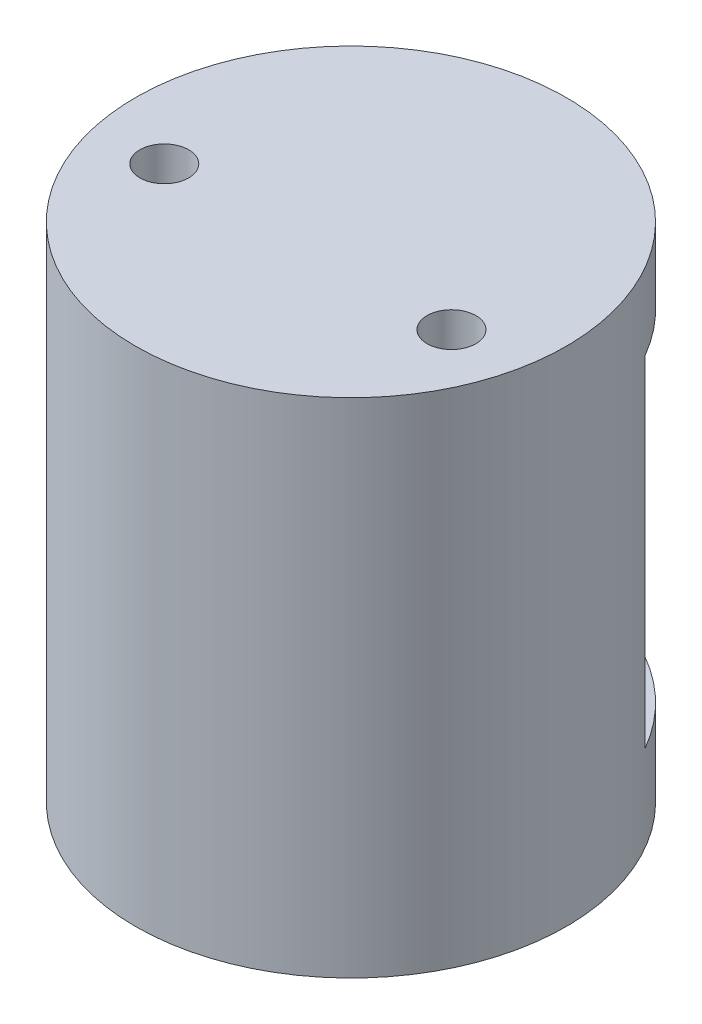
ISO-10303-21;
HEADER;
FILE_DESCRIPTION(('STEP AP214'),'2;1');
FILE_NAME('part.step','',(''),(''),'','','');
FILE_SCHEMA(('AUTOMOTIVE_DESIGN { 1 0 10303 214 1 1 1 1 }'));
ENDSEC;
DATA;
#1=APPLICATION_CONTEXT('core data for automotive mechanical design processes');
#2=APPLICATION_PROTOCOL_DEFINITION('international standard','automotive_design',2000,#1);
#3=PRODUCT_CONTEXT('',#1,'mechanical');
#4=PRODUCT('Part','Part','',(#3));
#5=PRODUCT_RELATED_PRODUCT_CATEGORY('part','',(#4));
#6=PRODUCT_DEFINITION_FORMATION('','',#4);
#7=PRODUCT_DEFINITION_CONTEXT('part definition',#1,'design');
#8=PRODUCT_DEFINITION('design','',#6,#7);
#9=PRODUCT_DEFINITION_SHAPE('','',#8);
#10=(LENGTH_UNIT() NAMED_UNIT(*) SI_UNIT(.MILLI.,.METRE.));
#11=(NAMED_UNIT(*) PLANE_ANGLE_UNIT() SI_UNIT($,.RADIAN.));
#12=(NAMED_UNIT(*) SI_UNIT($,.STERADIAN.) SOLID_ANGLE_UNIT());
#13=UNCERTAINTY_MEASURE_WITH_UNIT(LENGTH_MEASURE(1.E-05),#10,'distance_accuracy_value','');
#14=(GEOMETRIC_REPRESENTATION_CONTEXT(3) GLOBAL_UNCERTAINTY_ASSIGNED_CONTEXT((#13)) GLOBAL_UNIT_ASSIGNED_CONTEXT((#10,
#11,#12)) REPRESENTATION_CONTEXT('',''));
#15=CARTESIAN_POINT('',(0.,0.,0.));
#16=DIRECTION('',(0.,0.,1.));
#17=DIRECTION('',(1.,0.,0.));
#18=AXIS2_PLACEMENT_3D('',#15,#16,#17);
#19=CARTESIAN_POINT('',(0.,35.,0.));
#20=DIRECTION('',(0.,-1.,0.));
#21=DIRECTION('',(0.,0.,-1.));
#22=AXIS2_PLACEMENT_3D('',#19,#20,#21);
#23=CYLINDRICAL_SURFACE('',#22,15.);
#24=CARTESIAN_POINT('',(0.,0.,0.));
#25=DIRECTION('',(0.,1.,0.));
#26=DIRECTION('',(0.,0.,1.));
#27=AXIS2_PLACEMENT_3D('',#24,#25,#26);
#28=CIRCLE('',#27,15.);
#29=CARTESIAN_POINT('',(0.,0.,15.));
#30=VERTEX_POINT('',#29);
#31=EDGE_CURVE('E183',#30,#30,#28,.T.);
#32=ORIENTED_EDGE('',*,*,#31,.T.);
#33=EDGE_LOOP('',(#32));
#34=FACE_BOUND('',#33,.T.);
#35=CARTESIAN_POINT('',(0.,35.,0.));
#36=DIRECTION('',(0.,1.,0.));
#37=DIRECTION('',(0.,0.,1.));
#38=AXIS2_PLACEMENT_3D('',#35,#36,#37);
#39=CIRCLE('',#38,15.);
#40=CARTESIAN_POINT('',(0.,35.,15.));
#41=VERTEX_POINT('',#40);
#42=EDGE_CURVE('E184',#41,#41,#39,.T.);
#43=ORIENTED_EDGE('',*,*,#42,.F.);
#44=EDGE_LOOP('',(#43));
#45=FACE_BOUND('',#44,.T.);
#46=DIRECTION('',(0.,-1.,0.));
#47=VECTOR('',#46,1.);
#48=CARTESIAN_POINT('',(-14.9916643505649,35.,-0.499999999999999));
#49=LINE('',#48,#47);
#50=CARTESIAN_POINT('',(-14.9916643505649,30.7,-0.5));
#51=VERTEX_POINT('',#50);
#52=CARTESIAN_POINT('',(-14.9916643505649,29.7,-0.5));
#53=VERTEX_POINT('',#52);
#54=EDGE_CURVE('E11',#51,#53,#49,.T.);
#55=ORIENTED_EDGE('',*,*,#54,.F.);
#56=CARTESIAN_POINT('',(0.,30.7,0.));
#57=DIRECTION('',(0.,-1.,0.));
#58=DIRECTION('',(0.,0.,-1.));
#59=AXIS2_PLACEMENT_3D('',#56,#57,#58);
#60=CIRCLE('',#59,15.);
#61=CARTESIAN_POINT('',(-13.7477270848675,30.7,6.));
#62=VERTEX_POINT('',#61);
#63=EDGE_CURVE('E47',#62,#51,#60,.T.);
#64=ORIENTED_EDGE('',*,*,#63,.F.);
#65=DIRECTION('',(0.,-1.,0.));
#66=VECTOR('',#65,1.);
#67=CARTESIAN_POINT('',(-13.7477270848675,35.,6.));
#68=LINE('',#67,#66);
#69=CARTESIAN_POINT('',(-13.7477270848675,5.,5.99999999999999));
#70=VERTEX_POINT('',#69);
#71=EDGE_CURVE('E206',#70,#62,#68,.F.);
#72=ORIENTED_EDGE('',*,*,#71,.F.);
#73=CARTESIAN_POINT('',(0.,5.,0.));
#74=DIRECTION('',(0.,1.,0.));
#75=DIRECTION('',(0.,0.,1.));
#76=AXIS2_PLACEMENT_3D('',#73,#74,#75);
#77=CIRCLE('',#76,15.);
#78=CARTESIAN_POINT('',(-14.9916643505649,5.,-0.500000000000003));
#79=VERTEX_POINT('',#78);
#80=EDGE_CURVE('E203',#79,#70,#77,.T.);
#81=ORIENTED_EDGE('',*,*,#80,.F.);
#82=DIRECTION('',(0.,-1.,0.));
#83=VECTOR('',#82,1.);
#84=CARTESIAN_POINT('',(-14.9916643505649,35.,-0.499999999999986));
#85=LINE('',#84,#83);
#86=CARTESIAN_POINT('',(-14.9916643505649,6.,-0.500000000000002));
#87=VERTEX_POINT('',#86);
#88=EDGE_CURVE('E200',#87,#79,#85,.T.);
#89=ORIENTED_EDGE('',*,*,#88,.F.);
#90=CARTESIAN_POINT('',(0.,6.,0.));
#91=DIRECTION('',(0.,1.,0.));
#92=DIRECTION('',(0.,0.,1.));
#93=AXIS2_PLACEMENT_3D('',#90,#91,#92);
#94=CIRCLE('',#93,15.);
#95=CARTESIAN_POINT('',(13.,6.,-7.48331477354788));
#96=VERTEX_POINT('',#95);
#97=EDGE_CURVE('E197',#96,#87,#94,.T.);
#98=ORIENTED_EDGE('',*,*,#97,.F.);
#99=DIRECTION('',(0.,-1.,0.));
#100=VECTOR('',#99,1.);
#101=CARTESIAN_POINT('',(13.,35.,-7.48331477354788));
#102=LINE('',#101,#100);
#103=CARTESIAN_POINT('',(13.,29.7,-7.48331477354788));
#104=VERTEX_POINT('',#103);
#105=EDGE_CURVE('E188',#104,#96,#102,.T.);
#106=ORIENTED_EDGE('',*,*,#105,.F.);
#107=CARTESIAN_POINT('',(0.,29.7,0.));
#108=DIRECTION('',(0.,-1.,0.));
#109=DIRECTION('',(0.,0.,-1.));
#110=AXIS2_PLACEMENT_3D('',#107,#108,#109);
#111=CIRCLE('',#110,15.);
#112=EDGE_CURVE('E194',#53,#104,#111,.T.);
#113=ORIENTED_EDGE('',*,*,#112,.F.);
#114=EDGE_LOOP('',(#55,#64,#72,#81,#89,#98,#106,#113));
#115=FACE_BOUND('',#114,.T.);
#116=ADVANCED_FACE('F39',(#34,#45,#115),#23,.T.);
#117=CARTESIAN_POINT('',(0.,35.,0.));
#118=DIRECTION('',(0.,1.,0.));
#119=DIRECTION('',(0.,0.,1.));
#120=AXIS2_PLACEMENT_3D('',#117,#118,#119);
#121=PLANE('',#120);
#122=CARTESIAN_POINT('',(-10.,35.,3.));
#123=DIRECTION('',(0.,1.,0.));
#124=DIRECTION('',(0.,0.,1.));
#125=AXIS2_PLACEMENT_3D('',#122,#123,#124);
#126=CIRCLE('',#125,1.7);
#127=CARTESIAN_POINT('',(-10.,35.,4.7));
#128=VERTEX_POINT('',#127);
#129=EDGE_CURVE('E403',#128,#128,#126,.T.);
#130=ORIENTED_EDGE('',*,*,#129,.F.);
#131=EDGE_LOOP('',(#130));
#132=FACE_BOUND('',#131,.T.);
#133=CARTESIAN_POINT('',(10.,35.,3.));
#134=DIRECTION('',(0.,1.,0.));
#135=DIRECTION('',(0.,0.,1.));
#136=AXIS2_PLACEMENT_3D('',#133,#134,#135);
#137=CIRCLE('',#136,1.7);
#138=CARTESIAN_POINT('',(10.,35.,4.7));
#139=VERTEX_POINT('',#138);
#140=EDGE_CURVE('E410',#139,#139,#137,.T.);
#141=ORIENTED_EDGE('',*,*,#140,.F.);
#142=EDGE_LOOP('',(#141));
#143=FACE_BOUND('',#142,.T.);
#144=ORIENTED_EDGE('',*,*,#42,.T.);
#145=EDGE_LOOP('',(#144));
#146=FACE_BOUND('',#145,.T.);
#147=ADVANCED_FACE('F252',(#132,#143,#146),#121,.T.);
#148=CARTESIAN_POINT('',(0.,0.,0.));
#149=DIRECTION('',(0.,1.,0.));
#150=DIRECTION('',(0.,0.,1.));
#151=AXIS2_PLACEMENT_3D('',#148,#149,#150);
#152=PLANE('',#151);
#153=DIRECTION('',(-1.,0.,0.));
#154=VECTOR('',#153,1.);
#155=CARTESIAN_POINT('',(-9.69793792514677,0.,8.2));
#156=LINE('',#155,#154);
#157=CARTESIAN_POINT('',(9.69793792514677,0.,8.2));
#158=VERTEX_POINT('',#157);
#159=CARTESIAN_POINT('',(-9.69793792514677,0.,8.2));
#160=VERTEX_POINT('',#159);
#161=EDGE_CURVE('E123',#158,#160,#156,.T.);
#162=ORIENTED_EDGE('',*,*,#161,.F.);
#163=CARTESIAN_POINT('',(0.,0.,0.));
#164=DIRECTION('',(0.,-1.,0.));
#165=DIRECTION('',(0.,0.,-1.));
#166=AXIS2_PLACEMENT_3D('',#163,#164,#165);
#167=CIRCLE('',#166,12.7);
#168=EDGE_CURVE('E54',#160,#158,#167,.T.);
#169=ORIENTED_EDGE('',*,*,#168,.F.);
#170=EDGE_LOOP('',(#162,#169));
#171=FACE_BOUND('',#170,.T.);
#172=ORIENTED_EDGE('',*,*,#31,.F.);
#173=EDGE_LOOP('',(#172));
#174=FACE_BOUND('',#173,.T.);
#175=ADVANCED_FACE('F257',(#171,#174),#152,.F.);
#176=CARTESIAN_POINT('',(13.,30.7,6.));
#177=DIRECTION('',(0.,-1.,0.));
#178=DIRECTION('',(0.,0.,-1.));
#179=AXIS2_PLACEMENT_3D('',#176,#177,#178);
#180=PLANE('',#179);
#181=CARTESIAN_POINT('',(-10.,30.7,3.));
#182=DIRECTION('',(0.,-1.,0.));
#183=DIRECTION('',(0.,0.,-1.));
#184=AXIS2_PLACEMENT_3D('',#181,#182,#183);
#185=CIRCLE('',#184,1.7);
#186=CARTESIAN_POINT('',(-10.,30.7,1.3));
#187=VERTEX_POINT('',#186);
#188=EDGE_CURVE('E400',#187,#187,#185,.F.);
#189=ORIENTED_EDGE('',*,*,#188,.T.);
#190=EDGE_LOOP('',(#189));
#191=FACE_BOUND('',#190,.T.);
#192=CARTESIAN_POINT('',(10.,30.7,3.));
#193=DIRECTION('',(0.,-1.,0.));
#194=DIRECTION('',(0.,0.,-1.));
#195=AXIS2_PLACEMENT_3D('',#192,#193,#194);
#196=CIRCLE('',#195,1.7);
#197=CARTESIAN_POINT('',(10.,30.7,1.3));
#198=VERTEX_POINT('',#197);
#199=EDGE_CURVE('E413',#198,#198,#196,.F.);
#200=ORIENTED_EDGE('',*,*,#199,.T.);
#201=EDGE_LOOP('',(#200));
#202=FACE_BOUND('',#201,.T.);
#203=ORIENTED_EDGE('',*,*,#63,.T.);
#204=DIRECTION('',(-1.,0.,0.));
#205=VECTOR('',#204,1.);
#206=CARTESIAN_POINT('',(13.,30.7,-0.5));
#207=LINE('',#206,#205);
#208=CARTESIAN_POINT('',(13.,30.7,-0.5));
#209=VERTEX_POINT('',#208);
#210=EDGE_CURVE('E159',#209,#51,#207,.T.);
#211=ORIENTED_EDGE('',*,*,#210,.F.);
#212=DIRECTION('',(0.,0.,1.));
#213=VECTOR('',#212,1.);
#214=CARTESIAN_POINT('',(13.,30.7,6.));
#215=LINE('',#214,#213);
#216=CARTESIAN_POINT('',(13.,30.7,6.));
#217=VERTEX_POINT('',#216);
#218=EDGE_CURVE('E136',#209,#217,#215,.T.);
#219=ORIENTED_EDGE('',*,*,#218,.T.);
#220=DIRECTION('',(-1.,0.,0.));
#221=VECTOR('',#220,1.);
#222=CARTESIAN_POINT('',(13.,30.7,6.));
#223=LINE('',#222,#221);
#224=EDGE_CURVE('E179',#217,#62,#223,.T.);
#225=ORIENTED_EDGE('',*,*,#224,.T.);
#226=EDGE_LOOP('',(#203,#211,#219,#225));
#227=FACE_BOUND('',#226,.T.);
#228=ADVANCED_FACE('F212',(#191,#202,#227),#180,.T.);
#229=CARTESIAN_POINT('',(13.,30.7,6.));
#230=DIRECTION('',(0.,0.,-1.));
#231=DIRECTION('',(0.,1.,0.));
#232=AXIS2_PLACEMENT_3D('',#229,#230,#231);
#233=PLANE('',#232);
#234=ORIENTED_EDGE('',*,*,#71,.T.);
#235=ORIENTED_EDGE('',*,*,#224,.F.);
#236=DIRECTION('',(0.,-1.,0.));
#237=VECTOR('',#236,1.);
#238=CARTESIAN_POINT('',(13.,30.7,6.));
#239=LINE('',#238,#237);
#240=CARTESIAN_POINT('',(13.,5.,6.));
#241=VERTEX_POINT('',#240);
#242=EDGE_CURVE('E141',#217,#241,#239,.T.);
#243=ORIENTED_EDGE('',*,*,#242,.T.);
#244=DIRECTION('',(-1.,0.,0.));
#245=VECTOR('',#244,1.);
#246=CARTESIAN_POINT('',(13.,5.,6.));
#247=LINE('',#246,#245);
#248=EDGE_CURVE('E175',#241,#70,#247,.T.);
#249=ORIENTED_EDGE('',*,*,#248,.T.);
#250=EDGE_LOOP('',(#234,#235,#243,#249));
#251=FACE_BOUND('',#250,.T.);
#252=ADVANCED_FACE('F229',(#251),#233,.T.);
#253=CARTESIAN_POINT('',(13.,5.,-0.500000000000003));
#254=DIRECTION('',(0.,1.,0.));
#255=DIRECTION('',(0.,0.,1.));
#256=AXIS2_PLACEMENT_3D('',#253,#254,#255);
#257=PLANE('',#256);
#258=ORIENTED_EDGE('',*,*,#80,.T.);
#259=ORIENTED_EDGE('',*,*,#248,.F.);
#260=DIRECTION('',(0.,0.,-1.));
#261=VECTOR('',#260,1.);
#262=CARTESIAN_POINT('',(13.,5.,-0.500000000000003));
#263=LINE('',#262,#261);
#264=CARTESIAN_POINT('',(13.,5.,-0.500000000000003));
#265=VERTEX_POINT('',#264);
#266=EDGE_CURVE('E144',#241,#265,#263,.T.);
#267=ORIENTED_EDGE('',*,*,#266,.T.);
#268=DIRECTION('',(-1.,0.,0.));
#269=VECTOR('',#268,1.);
#270=CARTESIAN_POINT('',(13.,5.,-0.500000000000003));
#271=LINE('',#270,#269);
#272=EDGE_CURVE('E171',#265,#79,#271,.T.);
#273=ORIENTED_EDGE('',*,*,#272,.T.);
#274=EDGE_LOOP('',(#258,#259,#267,#273));
#275=FACE_BOUND('',#274,.T.);
#276=ADVANCED_FACE('F234',(#275),#257,.T.);
#277=CARTESIAN_POINT('',(13.,6.,-0.500000000000002));
#278=DIRECTION('',(0.,0.,1.));
#279=DIRECTION('',(0.,-1.,0.));
#280=AXIS2_PLACEMENT_3D('',#277,#278,#279);
#281=PLANE('',#280);
#282=ORIENTED_EDGE('',*,*,#88,.T.);
#283=ORIENTED_EDGE('',*,*,#272,.F.);
#284=DIRECTION('',(0.,1.,0.));
#285=VECTOR('',#284,1.);
#286=CARTESIAN_POINT('',(13.,6.,-0.500000000000002));
#287=LINE('',#286,#285);
#288=CARTESIAN_POINT('',(13.,6.,-0.500000000000002));
#289=VERTEX_POINT('',#288);
#290=EDGE_CURVE('E147',#265,#289,#287,.T.);
#291=ORIENTED_EDGE('',*,*,#290,.T.);
#292=DIRECTION('',(-1.,0.,0.));
#293=VECTOR('',#292,1.);
#294=CARTESIAN_POINT('',(13.,6.,-0.500000000000002));
#295=LINE('',#294,#293);
#296=EDGE_CURVE('E167',#289,#87,#295,.T.);
#297=ORIENTED_EDGE('',*,*,#296,.T.);
#298=EDGE_LOOP('',(#282,#283,#291,#297));
#299=FACE_BOUND('',#298,.T.);
#300=ADVANCED_FACE('F238',(#299),#281,.T.);
#301=CARTESIAN_POINT('',(13.,6.,-16.));
#302=DIRECTION('',(0.,1.,0.));
#303=DIRECTION('',(0.,0.,1.));
#304=AXIS2_PLACEMENT_3D('',#301,#302,#303);
#305=PLANE('',#304);
#306=ORIENTED_EDGE('',*,*,#97,.T.);
#307=ORIENTED_EDGE('',*,*,#296,.F.);
#308=DIRECTION('',(0.,0.,-1.));
#309=VECTOR('',#308,1.);
#310=CARTESIAN_POINT('',(13.,6.,-16.));
#311=LINE('',#310,#309);
#312=EDGE_CURVE('E150',#289,#96,#311,.T.);
#313=ORIENTED_EDGE('',*,*,#312,.T.);
#314=EDGE_LOOP('',(#306,#307,#313));
#315=FACE_BOUND('',#314,.T.);
#316=ADVANCED_FACE('F242',(#315),#305,.T.);
#317=CARTESIAN_POINT('',(13.,29.7,-0.5));
#318=DIRECTION('',(0.,-1.,0.));
#319=DIRECTION('',(0.,0.,-1.));
#320=AXIS2_PLACEMENT_3D('',#317,#318,#319);
#321=PLANE('',#320);
#322=ORIENTED_EDGE('',*,*,#112,.T.);
#323=DIRECTION('',(0.,0.,1.));
#324=VECTOR('',#323,1.);
#325=CARTESIAN_POINT('',(13.,29.7,-0.5));
#326=LINE('',#325,#324);
#327=CARTESIAN_POINT('',(13.,29.7,-0.5));
#328=VERTEX_POINT('',#327);
#329=EDGE_CURVE('E62',#104,#328,#326,.T.);
#330=ORIENTED_EDGE('',*,*,#329,.T.);
#331=DIRECTION('',(-1.,0.,0.));
#332=VECTOR('',#331,1.);
#333=CARTESIAN_POINT('',(13.,29.7,-0.5));
#334=LINE('',#333,#332);
#335=EDGE_CURVE('E163',#328,#53,#334,.T.);
#336=ORIENTED_EDGE('',*,*,#335,.T.);
#337=EDGE_LOOP('',(#322,#330,#336));
#338=FACE_BOUND('',#337,.T.);
#339=ADVANCED_FACE('F225',(#338),#321,.T.);
#340=CARTESIAN_POINT('',(13.,30.7,-0.5));
#341=DIRECTION('',(0.,0.,1.));
#342=DIRECTION('',(0.,-1.,0.));
#343=AXIS2_PLACEMENT_3D('',#340,#341,#342);
#344=PLANE('',#343);
#345=ORIENTED_EDGE('',*,*,#54,.T.);
#346=ORIENTED_EDGE('',*,*,#335,.F.);
#347=DIRECTION('',(0.,1.,0.));
#348=VECTOR('',#347,1.);
#349=CARTESIAN_POINT('',(13.,30.7,-0.5));
#350=LINE('',#349,#348);
#351=EDGE_CURVE('E156',#328,#209,#350,.T.);
#352=ORIENTED_EDGE('',*,*,#351,.T.);
#353=ORIENTED_EDGE('',*,*,#210,.T.);
#354=EDGE_LOOP('',(#345,#346,#352,#353));
#355=FACE_BOUND('',#354,.T.);
#356=ADVANCED_FACE('F219',(#355),#344,.T.);
#357=CARTESIAN_POINT('',(13.,0.,0.));
#358=DIRECTION('',(-1.,0.,0.));
#359=DIRECTION('',(0.,0.,1.));
#360=AXIS2_PLACEMENT_3D('',#357,#358,#359);
#361=PLANE('',#360);
#362=ORIENTED_EDGE('',*,*,#105,.T.);
#363=ORIENTED_EDGE('',*,*,#312,.F.);
#364=ORIENTED_EDGE('',*,*,#290,.F.);
#365=ORIENTED_EDGE('',*,*,#266,.F.);
#366=ORIENTED_EDGE('',*,*,#242,.F.);
#367=ORIENTED_EDGE('',*,*,#218,.F.);
#368=ORIENTED_EDGE('',*,*,#351,.F.);
#369=ORIENTED_EDGE('',*,*,#329,.F.);
#370=EDGE_LOOP('',(#362,#363,#364,#365,#366,#367,#368,#369));
#371=FACE_BOUND('',#370,.T.);
#372=ADVANCED_FACE('F226',(#371),#361,.T.);
#373=CARTESIAN_POINT('',(0.,1.5,0.));
#374=DIRECTION('',(0.,-1.,0.));
#375=DIRECTION('',(0.,0.,-1.));
#376=AXIS2_PLACEMENT_3D('',#373,#374,#375);
#377=CYLINDRICAL_SURFACE('',#376,12.7);
#378=ORIENTED_EDGE('',*,*,#168,.T.);
#379=DIRECTION('',(0.,-1.,0.));
#380=VECTOR('',#379,1.);
#381=CARTESIAN_POINT('',(9.69793792514677,1.5,8.2));
#382=LINE('',#381,#380);
#383=CARTESIAN_POINT('',(9.69793792514677,1.5,8.2));
#384=VERTEX_POINT('',#383);
#385=EDGE_CURVE('E107',#384,#158,#382,.T.);
#386=ORIENTED_EDGE('',*,*,#385,.F.);
#387=CARTESIAN_POINT('',(0.,1.5,0.));
#388=DIRECTION('',(0.,-1.,0.));
#389=DIRECTION('',(0.,0.,-1.));
#390=AXIS2_PLACEMENT_3D('',#387,#388,#389);
#391=CIRCLE('',#390,12.7);
#392=CARTESIAN_POINT('',(-9.69793792514677,1.5,8.2));
#393=VERTEX_POINT('',#392);
#394=EDGE_CURVE('E110',#393,#384,#391,.T.);
#395=ORIENTED_EDGE('',*,*,#394,.F.);
#396=DIRECTION('',(0.,-1.,0.));
#397=VECTOR('',#396,1.);
#398=CARTESIAN_POINT('',(-9.69793792514677,1.5,8.2));
#399=LINE('',#398,#397);
#400=EDGE_CURVE('E117',#393,#160,#399,.T.);
#401=ORIENTED_EDGE('',*,*,#400,.T.);
#402=EDGE_LOOP('',(#378,#386,#395,#401));
#403=FACE_BOUND('',#402,.T.);
#404=ADVANCED_FACE('F109',(#403),#377,.F.);
#405=CARTESIAN_POINT('',(-9.69793792514677,1.5,8.2));
#406=DIRECTION('',(0.,0.,1.));
#407=DIRECTION('',(1.,0.,0.));
#408=AXIS2_PLACEMENT_3D('',#405,#406,#407);
#409=PLANE('',#408);
#410=ORIENTED_EDGE('',*,*,#161,.T.);
#411=ORIENTED_EDGE('',*,*,#400,.F.);
#412=DIRECTION('',(-1.,0.,0.));
#413=VECTOR('',#412,1.);
#414=CARTESIAN_POINT('',(-9.69793792514677,1.5,8.2));
#415=LINE('',#414,#413);
#416=EDGE_CURVE('E118',#384,#393,#415,.T.);
#417=ORIENTED_EDGE('',*,*,#416,.F.);
#418=ORIENTED_EDGE('',*,*,#385,.T.);
#419=EDGE_LOOP('',(#410,#411,#417,#418));
#420=FACE_BOUND('',#419,.T.);
#421=ADVANCED_FACE('F125',(#420),#409,.F.);
#422=CARTESIAN_POINT('',(0.,1.5,0.));
#423=DIRECTION('',(0.,-1.,0.));
#424=DIRECTION('',(0.,0.,-1.));
#425=AXIS2_PLACEMENT_3D('',#422,#423,#424);
#426=PLANE('',#425);
#427=CARTESIAN_POINT('',(0.,1.5,-6.));
#428=DIRECTION('',(0.,-1.,0.));
#429=DIRECTION('',(0.,0.,-1.));
#430=AXIS2_PLACEMENT_3D('',#427,#428,#429);
#431=CIRCLE('',#430,2.1);
#432=CARTESIAN_POINT('',(0.,1.5,-8.1));
#433=VERTEX_POINT('',#432);
#434=EDGE_CURVE('E405',#433,#433,#431,.T.);
#435=ORIENTED_EDGE('',*,*,#434,.F.);
#436=EDGE_LOOP('',(#435));
#437=FACE_BOUND('',#436,.T.);
#438=ORIENTED_EDGE('',*,*,#394,.T.);
#439=ORIENTED_EDGE('',*,*,#416,.T.);
#440=EDGE_LOOP('',(#438,#439));
#441=FACE_BOUND('',#440,.T.);
#442=ADVANCED_FACE('F121',(#437,#441),#426,.T.);
#443=CARTESIAN_POINT('',(0.,3.7,-6.));
#444=DIRECTION('',(0.,-1.,0.));
#445=DIRECTION('',(0.,0.,-1.));
#446=AXIS2_PLACEMENT_3D('',#443,#444,#445);
#447=CYLINDRICAL_SURFACE('',#446,2.1);
#448=CARTESIAN_POINT('',(0.,3.7,-6.));
#449=DIRECTION('',(0.,-1.,0.));
#450=DIRECTION('',(0.,0.,-1.));
#451=AXIS2_PLACEMENT_3D('',#448,#449,#450);
#452=CIRCLE('',#451,2.1);
#453=CARTESIAN_POINT('',(0.,3.7,-8.1));
#454=VERTEX_POINT('',#453);
#455=EDGE_CURVE('E132',#454,#454,#452,.T.);
#456=ORIENTED_EDGE('',*,*,#455,.F.);
#457=EDGE_LOOP('',(#456));
#458=FACE_BOUND('',#457,.T.);
#459=ORIENTED_EDGE('',*,*,#434,.T.);
#460=EDGE_LOOP('',(#459));
#461=FACE_BOUND('',#460,.T.);
#462=ADVANCED_FACE('F341',(#458,#461),#447,.F.);
#463=CARTESIAN_POINT('',(0.,3.7,-6.));
#464=DIRECTION('',(0.,-1.,0.));
#465=DIRECTION('',(0.,0.,-1.));
#466=AXIS2_PLACEMENT_3D('',#463,#464,#465);
#467=PLANE('',#466);
#468=ORIENTED_EDGE('',*,*,#455,.T.);
#469=EDGE_LOOP('',(#468));
#470=FACE_BOUND('',#469,.T.);
#471=ADVANCED_FACE('F351',(#470),#467,.T.);
#472=CARTESIAN_POINT('',(10.,-0.001000000000001,3.));
#473=DIRECTION('',(0.,1.,0.));
#474=DIRECTION('',(0.,0.,1.));
#475=AXIS2_PLACEMENT_3D('',#472,#473,#474);
#476=CYLINDRICAL_SURFACE('',#475,1.7);
#477=ORIENTED_EDGE('',*,*,#199,.F.);
#478=EDGE_LOOP('',(#477));
#479=FACE_BOUND('',#478,.T.);
#480=ORIENTED_EDGE('',*,*,#140,.T.);
#481=EDGE_LOOP('',(#480));
#482=FACE_BOUND('',#481,.T.);
#483=ADVANCED_FACE('F361',(#479,#482),#476,.F.);
#484=CARTESIAN_POINT('',(-10.,-0.001000000000001,3.));
#485=DIRECTION('',(0.,1.,0.));
#486=DIRECTION('',(0.,0.,1.));
#487=AXIS2_PLACEMENT_3D('',#484,#485,#486);
#488=CYLINDRICAL_SURFACE('',#487,1.7);
#489=ORIENTED_EDGE('',*,*,#188,.F.);
#490=EDGE_LOOP('',(#489));
#491=FACE_BOUND('',#490,.T.);
#492=ORIENTED_EDGE('',*,*,#129,.T.);
#493=EDGE_LOOP('',(#492));
#494=FACE_BOUND('',#493,.T.);
#495=ADVANCED_FACE('F383',(#491,#494),#488,.F.);
#496=CLOSED_SHELL('',(#116,#147,#175,#228,#252,#276,#300,#316,#339,#356,#372,#404,#421,#442,
#462,#471,#483,#495));
#497=MANIFOLD_SOLID_BREP('B2',#496);
#498=ADVANCED_BREP_SHAPE_REPRESENTATION('',(#18,#497),#14);
#499=SHAPE_DEFINITION_REPRESENTATION(#9,#498);
ENDSEC;
END-ISO-10303-21;
